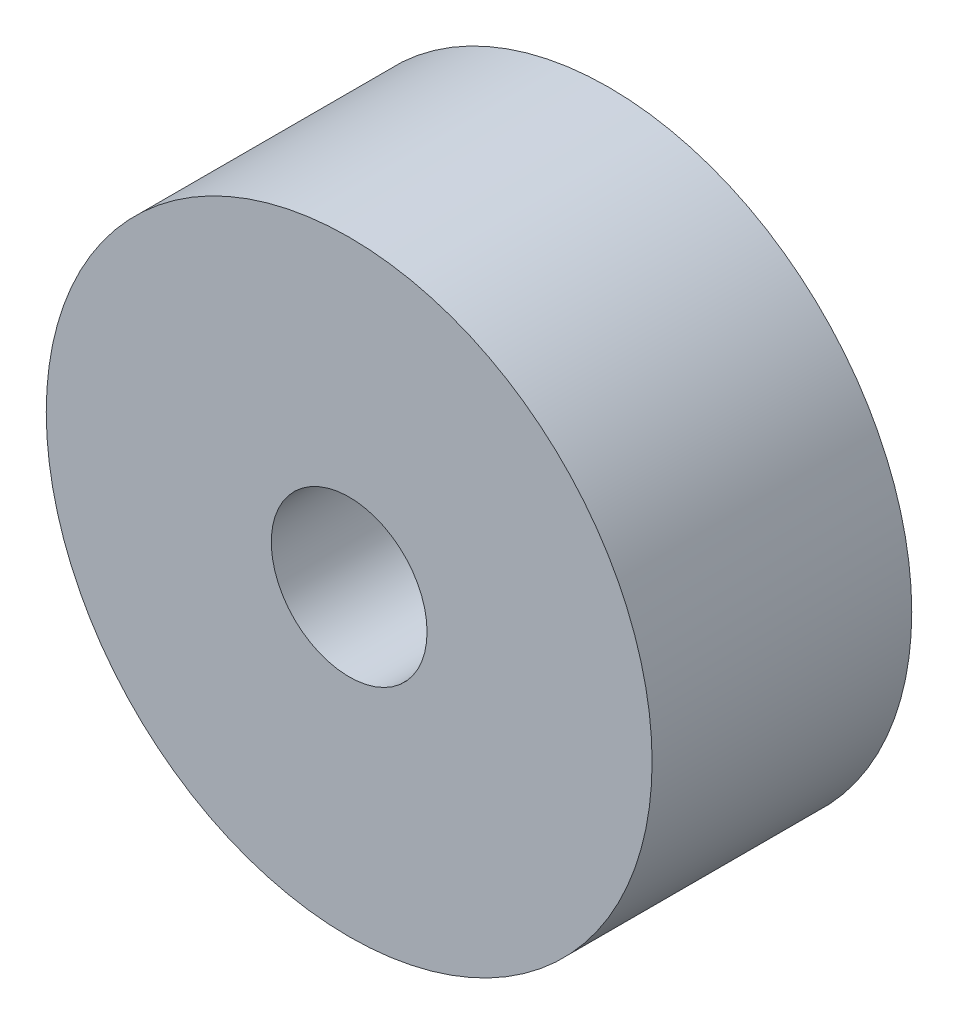
ISO-10303-21;
HEADER;
FILE_DESCRIPTION(('STEP AP214'),'2;1');
FILE_NAME('part.step','',(''),(''),'','','');
FILE_SCHEMA(('AUTOMOTIVE_DESIGN { 1 0 10303 214 1 1 1 1 }'));
ENDSEC;
DATA;
#1=APPLICATION_CONTEXT('core data for automotive mechanical design processes');
#2=APPLICATION_PROTOCOL_DEFINITION('international standard','automotive_design',2000,#1);
#3=PRODUCT_CONTEXT('',#1,'mechanical');
#4=PRODUCT('Part','Part','',(#3));
#5=PRODUCT_RELATED_PRODUCT_CATEGORY('part','',(#4));
#6=PRODUCT_DEFINITION_FORMATION('','',#4);
#7=PRODUCT_DEFINITION_CONTEXT('part definition',#1,'design');
#8=PRODUCT_DEFINITION('design','',#6,#7);
#9=PRODUCT_DEFINITION_SHAPE('','',#8);
#10=(LENGTH_UNIT() NAMED_UNIT(*) SI_UNIT(.MILLI.,.METRE.));
#11=(NAMED_UNIT(*) PLANE_ANGLE_UNIT() SI_UNIT($,.RADIAN.));
#12=(NAMED_UNIT(*) SI_UNIT($,.STERADIAN.) SOLID_ANGLE_UNIT());
#13=UNCERTAINTY_MEASURE_WITH_UNIT(LENGTH_MEASURE(1.E-05),#10,'distance_accuracy_value','');
#14=(GEOMETRIC_REPRESENTATION_CONTEXT(3) GLOBAL_UNCERTAINTY_ASSIGNED_CONTEXT((#13)) GLOBAL_UNIT_ASSIGNED_CONTEXT((#10,
#11,#12)) REPRESENTATION_CONTEXT('',''));
#15=CARTESIAN_POINT('',(0.,0.,0.));
#16=DIRECTION('',(0.,0.,1.));
#17=DIRECTION('',(1.,0.,0.));
#18=AXIS2_PLACEMENT_3D('',#15,#16,#17);
#19=CARTESIAN_POINT('',(0.,0.,300.));
#20=DIRECTION('',(0.,0.,1.));
#21=DIRECTION('',(1.,0.,0.));
#22=AXIS2_PLACEMENT_3D('',#19,#20,#21);
#23=PLANE('',#22);
#24=CARTESIAN_POINT('',(0.,0.,300.));
#25=DIRECTION('',(0.,0.,1.));
#26=DIRECTION('',(1.,0.,0.));
#27=AXIS2_PLACEMENT_3D('',#24,#25,#26);
#28=CIRCLE('',#27,350.);
#29=CARTESIAN_POINT('',(350.,0.,300.));
#30=VERTEX_POINT('',#29);
#31=EDGE_CURVE('E58',#30,#30,#28,.T.);
#32=ORIENTED_EDGE('',*,*,#31,.T.);
#33=EDGE_LOOP('',(#32));
#34=FACE_BOUND('',#33,.T.);
#35=CARTESIAN_POINT('',(0.,0.,300.));
#36=DIRECTION('',(0.,0.,1.));
#37=DIRECTION('',(1.,0.,0.));
#38=AXIS2_PLACEMENT_3D('',#35,#36,#37);
#39=CIRCLE('',#38,90.);
#40=CARTESIAN_POINT('',(90.,0.,300.));
#41=VERTEX_POINT('',#40);
#42=EDGE_CURVE('E65',#41,#41,#39,.T.);
#43=ORIENTED_EDGE('',*,*,#42,.F.);
#44=EDGE_LOOP('',(#43));
#45=FACE_BOUND('',#44,.T.);
#46=ADVANCED_FACE('F35',(#34,#45),#23,.T.);
#47=CARTESIAN_POINT('',(0.,0.,0.));
#48=DIRECTION('',(0.,0.,1.));
#49=DIRECTION('',(1.,0.,0.));
#50=AXIS2_PLACEMENT_3D('',#47,#48,#49);
#51=PLANE('',#50);
#52=CARTESIAN_POINT('',(0.,0.,0.));
#53=DIRECTION('',(0.,0.,1.));
#54=DIRECTION('',(1.,0.,0.));
#55=AXIS2_PLACEMENT_3D('',#52,#53,#54);
#56=CIRCLE('',#55,350.);
#57=CARTESIAN_POINT('',(350.,0.,0.));
#58=VERTEX_POINT('',#57);
#59=EDGE_CURVE('E52',#58,#58,#56,.T.);
#60=ORIENTED_EDGE('',*,*,#59,.F.);
#61=EDGE_LOOP('',(#60));
#62=FACE_BOUND('',#61,.T.);
#63=CARTESIAN_POINT('',(0.,0.,0.));
#64=DIRECTION('',(0.,0.,1.));
#65=DIRECTION('',(1.,0.,0.));
#66=AXIS2_PLACEMENT_3D('',#63,#64,#65);
#67=CIRCLE('',#66,90.);
#68=CARTESIAN_POINT('',(90.,0.,0.));
#69=VERTEX_POINT('',#68);
#70=EDGE_CURVE('E67',#69,#69,#67,.T.);
#71=ORIENTED_EDGE('',*,*,#70,.T.);
#72=EDGE_LOOP('',(#71));
#73=FACE_BOUND('',#72,.T.);
#74=ADVANCED_FACE('F77',(#62,#73),#51,.F.);
#75=CARTESIAN_POINT('',(0.,0.,300.));
#76=DIRECTION('',(0.,0.,-1.));
#77=DIRECTION('',(-1.,0.,0.));
#78=AXIS2_PLACEMENT_3D('',#75,#76,#77);
#79=CYLINDRICAL_SURFACE('',#78,350.);
#80=ORIENTED_EDGE('',*,*,#31,.F.);
#81=EDGE_LOOP('',(#80));
#82=FACE_BOUND('',#81,.T.);
#83=ORIENTED_EDGE('',*,*,#59,.T.);
#84=EDGE_LOOP('',(#83));
#85=FACE_BOUND('',#84,.T.);
#86=ADVANCED_FACE('F82',(#82,#85),#79,.T.);
#87=CARTESIAN_POINT('',(0.,0.,300.));
#88=DIRECTION('',(0.,0.,-1.));
#89=DIRECTION('',(-1.,0.,0.));
#90=AXIS2_PLACEMENT_3D('',#87,#88,#89);
#91=CYLINDRICAL_SURFACE('',#90,90.);
#92=ORIENTED_EDGE('',*,*,#42,.T.);
#93=EDGE_LOOP('',(#92));
#94=FACE_BOUND('',#93,.T.);
#95=ORIENTED_EDGE('',*,*,#70,.F.);
#96=EDGE_LOOP('',(#95));
#97=FACE_BOUND('',#96,.T.);
#98=ADVANCED_FACE('F73',(#94,#97),#91,.F.);
#99=CLOSED_SHELL('',(#46,#74,#86,#98));
#100=CARTESIAN_POINT('',(0.,0.,295.));
#101=DIRECTION('',(0.,0.,1.));
#102=DIRECTION('',(1.,0.,0.));
#103=AXIS2_PLACEMENT_3D('',#100,#101,#102);
#104=PLANE('',#103);
#105=CARTESIAN_POINT('',(0.,0.,295.));
#106=DIRECTION('',(0.,0.,1.));
#107=DIRECTION('',(1.,0.,0.));
#108=AXIS2_PLACEMENT_3D('',#105,#106,#107);
#109=CIRCLE('',#108,345.);
#110=CARTESIAN_POINT('',(345.,0.,295.));
#111=VERTEX_POINT('',#110);
#112=EDGE_CURVE('E39',#111,#111,#109,.T.);
#113=ORIENTED_EDGE('',*,*,#112,.F.);
#114=EDGE_LOOP('',(#113));
#115=FACE_BOUND('',#114,.T.);
#116=CARTESIAN_POINT('',(0.,0.,295.));
#117=DIRECTION('',(0.,0.,1.));
#118=DIRECTION('',(1.,0.,0.));
#119=AXIS2_PLACEMENT_3D('',#116,#117,#118);
#120=CIRCLE('',#119,95.);
#121=CARTESIAN_POINT('',(95.,0.,295.));
#122=VERTEX_POINT('',#121);
#123=EDGE_CURVE('E10',#122,#122,#120,.T.);
#124=ORIENTED_EDGE('',*,*,#123,.T.);
#125=EDGE_LOOP('',(#124));
#126=FACE_BOUND('',#125,.T.);
#127=ADVANCED_FACE('F90',(#115,#126),#104,.F.);
#128=CARTESIAN_POINT('',(0.,0.,5.));
#129=DIRECTION('',(0.,0.,1.));
#130=DIRECTION('',(1.,0.,0.));
#131=AXIS2_PLACEMENT_3D('',#128,#129,#130);
#132=PLANE('',#131);
#133=CARTESIAN_POINT('',(0.,0.,5.));
#134=DIRECTION('',(0.,0.,1.));
#135=DIRECTION('',(1.,0.,0.));
#136=AXIS2_PLACEMENT_3D('',#133,#134,#135);
#137=CIRCLE('',#136,345.);
#138=CARTESIAN_POINT('',(345.,0.,5.));
#139=VERTEX_POINT('',#138);
#140=EDGE_CURVE('E44',#139,#139,#137,.T.);
#141=ORIENTED_EDGE('',*,*,#140,.T.);
#142=EDGE_LOOP('',(#141));
#143=FACE_BOUND('',#142,.T.);
#144=CARTESIAN_POINT('',(0.,0.,5.));
#145=DIRECTION('',(0.,0.,1.));
#146=DIRECTION('',(1.,0.,0.));
#147=AXIS2_PLACEMENT_3D('',#144,#145,#146);
#148=CIRCLE('',#147,95.);
#149=CARTESIAN_POINT('',(95.,0.,5.));
#150=VERTEX_POINT('',#149);
#151=EDGE_CURVE('E49',#150,#150,#148,.T.);
#152=ORIENTED_EDGE('',*,*,#151,.F.);
#153=EDGE_LOOP('',(#152));
#154=FACE_BOUND('',#153,.T.);
#155=ADVANCED_FACE('F93',(#143,#154),#132,.T.);
#156=CARTESIAN_POINT('',(0.,0.,300.));
#157=DIRECTION('',(0.,0.,-1.));
#158=DIRECTION('',(-1.,0.,0.));
#159=AXIS2_PLACEMENT_3D('',#156,#157,#158);
#160=CYLINDRICAL_SURFACE('',#159,345.);
#161=ORIENTED_EDGE('',*,*,#112,.T.);
#162=EDGE_LOOP('',(#161));
#163=FACE_BOUND('',#162,.T.);
#164=ORIENTED_EDGE('',*,*,#140,.F.);
#165=EDGE_LOOP('',(#164));
#166=FACE_BOUND('',#165,.T.);
#167=ADVANCED_FACE('F97',(#163,#166),#160,.F.);
#168=CARTESIAN_POINT('',(0.,0.,300.));
#169=DIRECTION('',(0.,0.,-1.));
#170=DIRECTION('',(-1.,0.,0.));
#171=AXIS2_PLACEMENT_3D('',#168,#169,#170);
#172=CYLINDRICAL_SURFACE('',#171,95.);
#173=ORIENTED_EDGE('',*,*,#123,.F.);
#174=EDGE_LOOP('',(#173));
#175=FACE_BOUND('',#174,.T.);
#176=ORIENTED_EDGE('',*,*,#151,.T.);
#177=EDGE_LOOP('',(#176));
#178=FACE_BOUND('',#177,.T.);
#179=ADVANCED_FACE('F37',(#175,#178),#172,.T.);
#180=CLOSED_SHELL('',(#127,#155,#167,#179));
#181=ORIENTED_CLOSED_SHELL('',*,#180,.T.);
#182=BREP_WITH_VOIDS('B2',#99,(#181));
#183=ADVANCED_BREP_SHAPE_REPRESENTATION('',(#18,#182),#14);
#184=SHAPE_DEFINITION_REPRESENTATION(#9,#183);
ENDSEC;
END-ISO-10303-21;
